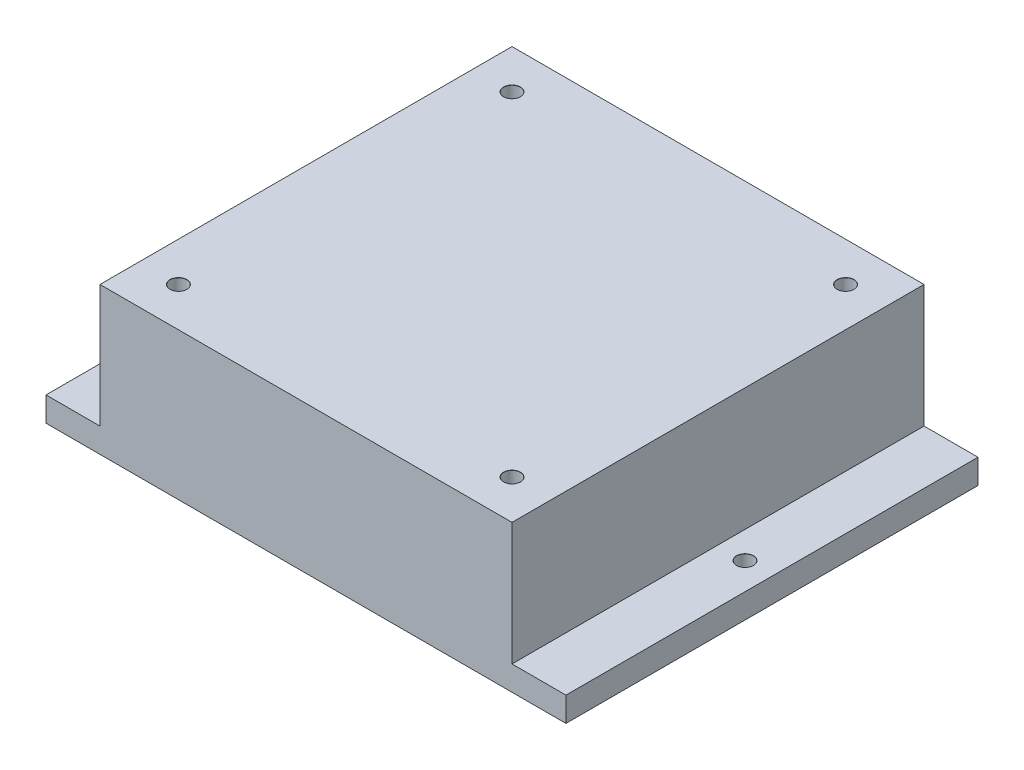
ISO-10303-21;
HEADER;
FILE_DESCRIPTION(('STEP AP214'),'2;1');
FILE_NAME('part.step','',(''),(''),'','','');
FILE_SCHEMA(('AUTOMOTIVE_DESIGN { 1 0 10303 214 1 1 1 1 }'));
ENDSEC;
DATA;
#1=APPLICATION_CONTEXT('core data for automotive mechanical design processes');
#2=APPLICATION_PROTOCOL_DEFINITION('international standard','automotive_design',2000,#1);
#3=PRODUCT_CONTEXT('',#1,'mechanical');
#4=PRODUCT('Part','Part','',(#3));
#5=PRODUCT_RELATED_PRODUCT_CATEGORY('part','',(#4));
#6=PRODUCT_DEFINITION_FORMATION('','',#4);
#7=PRODUCT_DEFINITION_CONTEXT('part definition',#1,'design');
#8=PRODUCT_DEFINITION('design','',#6,#7);
#9=PRODUCT_DEFINITION_SHAPE('','',#8);
#10=(LENGTH_UNIT() NAMED_UNIT(*) SI_UNIT(.MILLI.,.METRE.));
#11=(NAMED_UNIT(*) PLANE_ANGLE_UNIT() SI_UNIT($,.RADIAN.));
#12=(NAMED_UNIT(*) SI_UNIT($,.STERADIAN.) SOLID_ANGLE_UNIT());
#13=UNCERTAINTY_MEASURE_WITH_UNIT(LENGTH_MEASURE(1.E-05),#10,'distance_accuracy_value','');
#14=(GEOMETRIC_REPRESENTATION_CONTEXT(3) GLOBAL_UNCERTAINTY_ASSIGNED_CONTEXT((#13)) GLOBAL_UNIT_ASSIGNED_CONTEXT((#10,
#11,#12)) REPRESENTATION_CONTEXT('',''));
#15=CARTESIAN_POINT('',(0.,0.,0.));
#16=DIRECTION('',(0.,0.,1.));
#17=DIRECTION('',(1.,0.,0.));
#18=AXIS2_PLACEMENT_3D('',#15,#16,#17);
#19=CARTESIAN_POINT('',(53.,30.,-42.));
#20=DIRECTION('',(-1.,0.,0.));
#21=DIRECTION('',(0.,0.,1.));
#22=AXIS2_PLACEMENT_3D('',#19,#20,#21);
#23=PLANE('',#22);
#24=DIRECTION('',(0.,-1.,0.));
#25=VECTOR('',#24,1.);
#26=CARTESIAN_POINT('',(53.,30.,-42.));
#27=LINE('',#26,#25);
#28=CARTESIAN_POINT('',(53.,5.,-42.));
#29=VERTEX_POINT('',#28);
#30=CARTESIAN_POINT('',(53.,0.,-42.));
#31=VERTEX_POINT('',#30);
#32=EDGE_CURVE('E11',#29,#31,#27,.T.);
#33=ORIENTED_EDGE('',*,*,#32,.F.);
#34=DIRECTION('',(0.,0.,1.));
#35=VECTOR('',#34,1.);
#36=CARTESIAN_POINT('',(53.,5.,-42.));
#37=LINE('',#36,#35);
#38=CARTESIAN_POINT('',(53.,5.,42.));
#39=VERTEX_POINT('',#38);
#40=EDGE_CURVE('E176',#29,#39,#37,.T.);
#41=ORIENTED_EDGE('',*,*,#40,.T.);
#42=DIRECTION('',(0.,-1.,0.));
#43=VECTOR('',#42,1.);
#44=CARTESIAN_POINT('',(53.,30.,42.));
#45=LINE('',#44,#43);
#46=CARTESIAN_POINT('',(53.,0.,42.));
#47=VERTEX_POINT('',#46);
#48=EDGE_CURVE('E204',#39,#47,#45,.T.);
#49=ORIENTED_EDGE('',*,*,#48,.T.);
#50=DIRECTION('',(0.,0.,-1.));
#51=VECTOR('',#50,1.);
#52=CARTESIAN_POINT('',(53.,0.,-42.));
#53=LINE('',#52,#51);
#54=EDGE_CURVE('E179',#47,#31,#53,.T.);
#55=ORIENTED_EDGE('',*,*,#54,.T.);
#56=EDGE_LOOP('',(#33,#41,#49,#55));
#57=FACE_BOUND('',#56,.T.);
#58=ADVANCED_FACE('F47',(#57),#23,.F.);
#59=CARTESIAN_POINT('',(-53.,30.,-42.));
#60=DIRECTION('',(0.,0.,1.));
#61=DIRECTION('',(1.,0.,0.));
#62=AXIS2_PLACEMENT_3D('',#59,#60,#61);
#63=PLANE('',#62);
#64=DIRECTION('',(0.,-1.,0.));
#65=VECTOR('',#64,1.);
#66=CARTESIAN_POINT('',(42.,30.,-42.));
#67=LINE('',#66,#65);
#68=CARTESIAN_POINT('',(42.,30.,-42.));
#69=VERTEX_POINT('',#68);
#70=CARTESIAN_POINT('',(42.,4.99999999999999,-42.));
#71=VERTEX_POINT('',#70);
#72=EDGE_CURVE('E69',#69,#71,#67,.T.);
#73=ORIENTED_EDGE('',*,*,#72,.T.);
#74=DIRECTION('',(1.,0.,0.));
#75=VECTOR('',#74,1.);
#76=CARTESIAN_POINT('',(53.,5.,-42.));
#77=LINE('',#76,#75);
#78=EDGE_CURVE('E166',#71,#29,#77,.T.);
#79=ORIENTED_EDGE('',*,*,#78,.T.);
#80=ORIENTED_EDGE('',*,*,#32,.T.);
#81=DIRECTION('',(-1.,0.,0.));
#82=VECTOR('',#81,1.);
#83=CARTESIAN_POINT('',(-53.,0.,-42.));
#84=LINE('',#83,#82);
#85=CARTESIAN_POINT('',(-53.,0.,-42.));
#86=VERTEX_POINT('',#85);
#87=EDGE_CURVE('E207',#31,#86,#84,.T.);
#88=ORIENTED_EDGE('',*,*,#87,.T.);
#89=DIRECTION('',(0.,-1.,0.));
#90=VECTOR('',#89,1.);
#91=CARTESIAN_POINT('',(-53.,30.,-42.));
#92=LINE('',#91,#90);
#93=CARTESIAN_POINT('',(-53.,5.,-42.));
#94=VERTEX_POINT('',#93);
#95=EDGE_CURVE('E54',#94,#86,#92,.T.);
#96=ORIENTED_EDGE('',*,*,#95,.F.);
#97=DIRECTION('',(1.,0.,0.));
#98=VECTOR('',#97,1.);
#99=CARTESIAN_POINT('',(-53.,5.,-42.));
#100=LINE('',#99,#98);
#101=CARTESIAN_POINT('',(-42.,4.99999999999999,-42.));
#102=VERTEX_POINT('',#101);
#103=EDGE_CURVE('E183',#94,#102,#100,.T.);
#104=ORIENTED_EDGE('',*,*,#103,.T.);
#105=DIRECTION('',(0.,1.,0.));
#106=VECTOR('',#105,1.);
#107=CARTESIAN_POINT('',(-42.,30.,-42.));
#108=LINE('',#107,#106);
#109=CARTESIAN_POINT('',(-42.,30.,-42.));
#110=VERTEX_POINT('',#109);
#111=EDGE_CURVE('E186',#102,#110,#108,.T.);
#112=ORIENTED_EDGE('',*,*,#111,.T.);
#113=DIRECTION('',(-1.,0.,0.));
#114=VECTOR('',#113,1.);
#115=CARTESIAN_POINT('',(-53.,30.,-42.));
#116=LINE('',#115,#114);
#117=EDGE_CURVE('E197',#69,#110,#116,.T.);
#118=ORIENTED_EDGE('',*,*,#117,.F.);
#119=EDGE_LOOP('',(#73,#79,#80,#88,#96,#104,#112,#118));
#120=FACE_BOUND('',#119,.T.);
#121=ADVANCED_FACE('F226',(#120),#63,.F.);
#122=CARTESIAN_POINT('',(-53.,30.,-42.));
#123=DIRECTION('',(1.,0.,0.));
#124=DIRECTION('',(0.,0.,-1.));
#125=AXIS2_PLACEMENT_3D('',#122,#123,#124);
#126=PLANE('',#125);
#127=DIRECTION('',(0.,-1.,0.));
#128=VECTOR('',#127,1.);
#129=CARTESIAN_POINT('',(-53.,30.,42.));
#130=LINE('',#129,#128);
#131=CARTESIAN_POINT('',(-53.,5.,42.));
#132=VERTEX_POINT('',#131);
#133=CARTESIAN_POINT('',(-53.,0.,42.));
#134=VERTEX_POINT('',#133);
#135=EDGE_CURVE('E216',#132,#134,#130,.T.);
#136=ORIENTED_EDGE('',*,*,#135,.F.);
#137=DIRECTION('',(0.,0.,1.));
#138=VECTOR('',#137,1.);
#139=CARTESIAN_POINT('',(-53.,5.,-42.));
#140=LINE('',#139,#138);
#141=EDGE_CURVE('E189',#94,#132,#140,.T.);
#142=ORIENTED_EDGE('',*,*,#141,.F.);
#143=ORIENTED_EDGE('',*,*,#95,.T.);
#144=DIRECTION('',(0.,0.,1.));
#145=VECTOR('',#144,1.);
#146=CARTESIAN_POINT('',(-53.,0.,-42.));
#147=LINE('',#146,#145);
#148=EDGE_CURVE('E210',#86,#134,#147,.T.);
#149=ORIENTED_EDGE('',*,*,#148,.T.);
#150=EDGE_LOOP('',(#136,#142,#143,#149));
#151=FACE_BOUND('',#150,.T.);
#152=ADVANCED_FACE('F221',(#151),#126,.F.);
#153=CARTESIAN_POINT('',(-53.,30.,42.));
#154=DIRECTION('',(0.,0.,-1.));
#155=DIRECTION('',(-1.,0.,0.));
#156=AXIS2_PLACEMENT_3D('',#153,#154,#155);
#157=PLANE('',#156);
#158=ORIENTED_EDGE('',*,*,#48,.F.);
#159=DIRECTION('',(1.,0.,0.));
#160=VECTOR('',#159,1.);
#161=CARTESIAN_POINT('',(53.,5.,42.));
#162=LINE('',#161,#160);
#163=CARTESIAN_POINT('',(42.,4.99999999999999,42.));
#164=VERTEX_POINT('',#163);
#165=EDGE_CURVE('E167',#164,#39,#162,.T.);
#166=ORIENTED_EDGE('',*,*,#165,.F.);
#167=DIRECTION('',(0.,-1.,0.));
#168=VECTOR('',#167,1.);
#169=CARTESIAN_POINT('',(42.,30.,42.));
#170=LINE('',#169,#168);
#171=CARTESIAN_POINT('',(42.,30.,42.));
#172=VERTEX_POINT('',#171);
#173=EDGE_CURVE('E171',#172,#164,#170,.T.);
#174=ORIENTED_EDGE('',*,*,#173,.F.);
#175=DIRECTION('',(1.,0.,0.));
#176=VECTOR('',#175,1.);
#177=CARTESIAN_POINT('',(-53.,30.,42.));
#178=LINE('',#177,#176);
#179=CARTESIAN_POINT('',(-42.,30.,42.));
#180=VERTEX_POINT('',#179);
#181=EDGE_CURVE('E200',#180,#172,#178,.T.);
#182=ORIENTED_EDGE('',*,*,#181,.F.);
#183=DIRECTION('',(0.,1.,0.));
#184=VECTOR('',#183,1.);
#185=CARTESIAN_POINT('',(-42.,30.,42.));
#186=LINE('',#185,#184);
#187=CARTESIAN_POINT('',(-42.,4.99999999999999,42.));
#188=VERTEX_POINT('',#187);
#189=EDGE_CURVE('E61',#188,#180,#186,.T.);
#190=ORIENTED_EDGE('',*,*,#189,.F.);
#191=DIRECTION('',(1.,0.,0.));
#192=VECTOR('',#191,1.);
#193=CARTESIAN_POINT('',(-53.,5.,42.));
#194=LINE('',#193,#192);
#195=EDGE_CURVE('E164',#132,#188,#194,.T.);
#196=ORIENTED_EDGE('',*,*,#195,.F.);
#197=ORIENTED_EDGE('',*,*,#135,.T.);
#198=DIRECTION('',(1.,0.,0.));
#199=VECTOR('',#198,1.);
#200=CARTESIAN_POINT('',(-53.,0.,42.));
#201=LINE('',#200,#199);
#202=EDGE_CURVE('E201',#134,#47,#201,.T.);
#203=ORIENTED_EDGE('',*,*,#202,.T.);
#204=EDGE_LOOP('',(#158,#166,#174,#182,#190,#196,#197,#203));
#205=FACE_BOUND('',#204,.T.);
#206=ADVANCED_FACE('F233',(#205),#157,.F.);
#207=CARTESIAN_POINT('',(0.,30.,0.));
#208=DIRECTION('',(0.,1.,0.));
#209=DIRECTION('',(0.,0.,1.));
#210=AXIS2_PLACEMENT_3D('',#207,#208,#209);
#211=PLANE('',#210);
#212=CARTESIAN_POINT('',(-34.,30.,-34.));
#213=DIRECTION('',(0.,1.,0.));
#214=DIRECTION('',(0.,0.,1.));
#215=AXIS2_PLACEMENT_3D('',#212,#213,#214);
#216=CIRCLE('',#215,1.725);
#217=CARTESIAN_POINT('',(-34.,30.,-32.275));
#218=VERTEX_POINT('',#217);
#219=EDGE_CURVE('E137',#218,#218,#216,.T.);
#220=ORIENTED_EDGE('',*,*,#219,.F.);
#221=EDGE_LOOP('',(#220));
#222=FACE_BOUND('',#221,.T.);
#223=CARTESIAN_POINT('',(34.,30.,-34.));
#224=DIRECTION('',(0.,1.,0.));
#225=DIRECTION('',(0.,0.,1.));
#226=AXIS2_PLACEMENT_3D('',#223,#224,#225);
#227=CIRCLE('',#226,1.725);
#228=CARTESIAN_POINT('',(34.,30.,-32.275));
#229=VERTEX_POINT('',#228);
#230=EDGE_CURVE('E130',#229,#229,#227,.T.);
#231=ORIENTED_EDGE('',*,*,#230,.F.);
#232=EDGE_LOOP('',(#231));
#233=FACE_BOUND('',#232,.T.);
#234=CARTESIAN_POINT('',(34.,30.,34.));
#235=DIRECTION('',(0.,1.,0.));
#236=DIRECTION('',(0.,0.,1.));
#237=AXIS2_PLACEMENT_3D('',#234,#235,#236);
#238=CIRCLE('',#237,1.725);
#239=CARTESIAN_POINT('',(34.,30.,35.725));
#240=VERTEX_POINT('',#239);
#241=EDGE_CURVE('E146',#240,#240,#238,.T.);
#242=ORIENTED_EDGE('',*,*,#241,.F.);
#243=EDGE_LOOP('',(#242));
#244=FACE_BOUND('',#243,.T.);
#245=CARTESIAN_POINT('',(-34.,30.,34.));
#246=DIRECTION('',(0.,1.,0.));
#247=DIRECTION('',(0.,0.,1.));
#248=AXIS2_PLACEMENT_3D('',#245,#246,#247);
#249=CIRCLE('',#248,1.725);
#250=CARTESIAN_POINT('',(-34.,30.,35.725));
#251=VERTEX_POINT('',#250);
#252=EDGE_CURVE('E155',#251,#251,#249,.T.);
#253=ORIENTED_EDGE('',*,*,#252,.F.);
#254=EDGE_LOOP('',(#253));
#255=FACE_BOUND('',#254,.T.);
#256=DIRECTION('',(0.,0.,1.));
#257=VECTOR('',#256,1.);
#258=CARTESIAN_POINT('',(42.,30.,-42.));
#259=LINE('',#258,#257);
#260=EDGE_CURVE('E170',#69,#172,#259,.T.);
#261=ORIENTED_EDGE('',*,*,#260,.F.);
#262=ORIENTED_EDGE('',*,*,#117,.T.);
#263=DIRECTION('',(0.,0.,1.));
#264=VECTOR('',#263,1.);
#265=CARTESIAN_POINT('',(-42.,30.,-42.));
#266=LINE('',#265,#264);
#267=EDGE_CURVE('E174',#110,#180,#266,.T.);
#268=ORIENTED_EDGE('',*,*,#267,.T.);
#269=ORIENTED_EDGE('',*,*,#181,.T.);
#270=EDGE_LOOP('',(#261,#262,#268,#269));
#271=FACE_BOUND('',#270,.T.);
#272=ADVANCED_FACE('F242',(#222,#233,#244,#255,#271),#211,.T.);
#273=CARTESIAN_POINT('',(0.,0.,0.));
#274=DIRECTION('',(0.,1.,0.));
#275=DIRECTION('',(0.,0.,1.));
#276=AXIS2_PLACEMENT_3D('',#273,#274,#275);
#277=PLANE('',#276);
#278=CARTESIAN_POINT('',(-47.5,0.,0.));
#279=DIRECTION('',(0.,1.,0.));
#280=DIRECTION('',(0.,0.,1.));
#281=AXIS2_PLACEMENT_3D('',#278,#279,#280);
#282=CIRCLE('',#281,1.7);
#283=CARTESIAN_POINT('',(-47.5,0.,1.7));
#284=VERTEX_POINT('',#283);
#285=EDGE_CURVE('E343',#284,#284,#282,.T.);
#286=ORIENTED_EDGE('',*,*,#285,.T.);
#287=EDGE_LOOP('',(#286));
#288=FACE_BOUND('',#287,.T.);
#289=CARTESIAN_POINT('',(47.5,0.,0.));
#290=DIRECTION('',(0.,1.,0.));
#291=DIRECTION('',(0.,0.,1.));
#292=AXIS2_PLACEMENT_3D('',#289,#290,#291);
#293=CIRCLE('',#292,1.7);
#294=CARTESIAN_POINT('',(47.5,0.,1.7));
#295=VERTEX_POINT('',#294);
#296=EDGE_CURVE('E354',#295,#295,#293,.T.);
#297=ORIENTED_EDGE('',*,*,#296,.T.);
#298=EDGE_LOOP('',(#297));
#299=FACE_BOUND('',#298,.T.);
#300=ORIENTED_EDGE('',*,*,#54,.F.);
#301=ORIENTED_EDGE('',*,*,#202,.F.);
#302=ORIENTED_EDGE('',*,*,#148,.F.);
#303=ORIENTED_EDGE('',*,*,#87,.F.);
#304=EDGE_LOOP('',(#300,#301,#302,#303));
#305=FACE_BOUND('',#304,.T.);
#306=ADVANCED_FACE('F230',(#288,#299,#305),#277,.F.);
#307=CARTESIAN_POINT('',(-42.,30.,-42.));
#308=DIRECTION('',(1.,0.,0.));
#309=DIRECTION('',(0.,0.,-1.));
#310=AXIS2_PLACEMENT_3D('',#307,#308,#309);
#311=PLANE('',#310);
#312=ORIENTED_EDGE('',*,*,#189,.T.);
#313=ORIENTED_EDGE('',*,*,#267,.F.);
#314=ORIENTED_EDGE('',*,*,#111,.F.);
#315=DIRECTION('',(0.,0.,1.));
#316=VECTOR('',#315,1.);
#317=CARTESIAN_POINT('',(-42.,4.99999999999999,-42.));
#318=LINE('',#317,#316);
#319=EDGE_CURVE('E194',#102,#188,#318,.T.);
#320=ORIENTED_EDGE('',*,*,#319,.T.);
#321=EDGE_LOOP('',(#312,#313,#314,#320));
#322=FACE_BOUND('',#321,.T.);
#323=ADVANCED_FACE('F262',(#322),#311,.F.);
#324=CARTESIAN_POINT('',(-53.,5.,-42.));
#325=DIRECTION('',(0.,-1.,0.));
#326=DIRECTION('',(1.,0.,0.));
#327=AXIS2_PLACEMENT_3D('',#324,#325,#326);
#328=PLANE('',#327);
#329=CARTESIAN_POINT('',(-47.5,5.,0.));
#330=DIRECTION('',(0.,1.,0.));
#331=DIRECTION('',(0.,0.,1.));
#332=AXIS2_PLACEMENT_3D('',#329,#330,#331);
#333=CIRCLE('',#332,1.725);
#334=CARTESIAN_POINT('',(-47.5,5.,1.725));
#335=VERTEX_POINT('',#334);
#336=EDGE_CURVE('E341',#335,#335,#333,.T.);
#337=ORIENTED_EDGE('',*,*,#336,.F.);
#338=EDGE_LOOP('',(#337));
#339=FACE_BOUND('',#338,.T.);
#340=ORIENTED_EDGE('',*,*,#195,.T.);
#341=ORIENTED_EDGE('',*,*,#319,.F.);
#342=ORIENTED_EDGE('',*,*,#103,.F.);
#343=ORIENTED_EDGE('',*,*,#141,.T.);
#344=EDGE_LOOP('',(#340,#341,#342,#343));
#345=FACE_BOUND('',#344,.T.);
#346=ADVANCED_FACE('F238',(#339,#345),#328,.F.);
#347=CARTESIAN_POINT('',(53.,5.,-42.));
#348=DIRECTION('',(0.,-1.,0.));
#349=DIRECTION('',(1.,0.,0.));
#350=AXIS2_PLACEMENT_3D('',#347,#348,#349);
#351=PLANE('',#350);
#352=CARTESIAN_POINT('',(47.5,4.99999999999998,0.));
#353=DIRECTION('',(0.,1.,0.));
#354=DIRECTION('',(0.,0.,1.));
#355=AXIS2_PLACEMENT_3D('',#352,#353,#354);
#356=CIRCLE('',#355,1.725);
#357=CARTESIAN_POINT('',(47.5,4.99999999999998,1.725));
#358=VERTEX_POINT('',#357);
#359=EDGE_CURVE('E348',#358,#358,#356,.T.);
#360=ORIENTED_EDGE('',*,*,#359,.F.);
#361=EDGE_LOOP('',(#360));
#362=FACE_BOUND('',#361,.T.);
#363=ORIENTED_EDGE('',*,*,#165,.T.);
#364=ORIENTED_EDGE('',*,*,#40,.F.);
#365=ORIENTED_EDGE('',*,*,#78,.F.);
#366=DIRECTION('',(0.,0.,1.));
#367=VECTOR('',#366,1.);
#368=CARTESIAN_POINT('',(42.,4.99999999999999,-42.));
#369=LINE('',#368,#367);
#370=EDGE_CURVE('E180',#71,#164,#369,.T.);
#371=ORIENTED_EDGE('',*,*,#370,.T.);
#372=EDGE_LOOP('',(#363,#364,#365,#371));
#373=FACE_BOUND('',#372,.T.);
#374=ADVANCED_FACE('F246',(#362,#373),#351,.F.);
#375=CARTESIAN_POINT('',(42.,30.,-42.));
#376=DIRECTION('',(-1.,0.,0.));
#377=DIRECTION('',(0.,0.,1.));
#378=AXIS2_PLACEMENT_3D('',#375,#376,#377);
#379=PLANE('',#378);
#380=ORIENTED_EDGE('',*,*,#173,.T.);
#381=ORIENTED_EDGE('',*,*,#370,.F.);
#382=ORIENTED_EDGE('',*,*,#72,.F.);
#383=ORIENTED_EDGE('',*,*,#260,.T.);
#384=EDGE_LOOP('',(#380,#381,#382,#383));
#385=FACE_BOUND('',#384,.T.);
#386=ADVANCED_FACE('F244',(#385),#379,.F.);
#387=CARTESIAN_POINT('',(-34.,20.,34.));
#388=DIRECTION('',(0.,1.,0.));
#389=DIRECTION('',(0.,0.,1.));
#390=AXIS2_PLACEMENT_3D('',#387,#388,#389);
#391=CONICAL_SURFACE('',#390,1.69999999999999,1.02974425867665);
#392=CARTESIAN_POINT('',(-34.,18.9785369476531,34.));
#393=VERTEX_POINT('',#392);
#394=VERTEX_LOOP('',#393);
#395=FACE_BOUND('',#394,.T.);
#396=CARTESIAN_POINT('',(-34.,20.,34.));
#397=DIRECTION('',(0.,1.,0.));
#398=DIRECTION('',(0.,0.,1.));
#399=AXIS2_PLACEMENT_3D('',#396,#397,#398);
#400=CIRCLE('',#399,1.69999999999999);
#401=CARTESIAN_POINT('',(-34.,20.,35.7));
#402=VERTEX_POINT('',#401);
#403=EDGE_CURVE('E161',#402,#402,#400,.T.);
#404=ORIENTED_EDGE('',*,*,#403,.T.);
#405=EDGE_LOOP('',(#404));
#406=FACE_BOUND('',#405,.T.);
#407=ADVANCED_FACE('F274',(#395,#406),#391,.F.);
#408=CARTESIAN_POINT('',(-34.,30.,34.));
#409=DIRECTION('',(0.,1.,0.));
#410=DIRECTION('',(0.,0.,1.));
#411=AXIS2_PLACEMENT_3D('',#408,#409,#410);
#412=CYLINDRICAL_SURFACE('',#411,1.69999999999999);
#413=ORIENTED_EDGE('',*,*,#403,.F.);
#414=EDGE_LOOP('',(#413));
#415=FACE_BOUND('',#414,.T.);
#416=CARTESIAN_POINT('',(-34.,29.975,34.));
#417=DIRECTION('',(0.,1.,0.));
#418=DIRECTION('',(0.,0.,1.));
#419=AXIS2_PLACEMENT_3D('',#416,#417,#418);
#420=CIRCLE('',#419,1.69999999999999);
#421=CARTESIAN_POINT('',(-34.,29.975,35.7));
#422=VERTEX_POINT('',#421);
#423=EDGE_CURVE('E158',#422,#422,#420,.T.);
#424=ORIENTED_EDGE('',*,*,#423,.T.);
#425=EDGE_LOOP('',(#424));
#426=FACE_BOUND('',#425,.T.);
#427=ADVANCED_FACE('F280',(#415,#426),#412,.F.);
#428=CARTESIAN_POINT('',(-34.,30.,34.));
#429=DIRECTION('',(0.,1.,0.));
#430=DIRECTION('',(0.,0.,1.));
#431=AXIS2_PLACEMENT_3D('',#428,#429,#430);
#432=CONICAL_SURFACE('',#431,1.725,0.78539816339731);
#433=ORIENTED_EDGE('',*,*,#423,.F.);
#434=EDGE_LOOP('',(#433));
#435=FACE_BOUND('',#434,.T.);
#436=ORIENTED_EDGE('',*,*,#252,.T.);
#437=EDGE_LOOP('',(#436));
#438=FACE_BOUND('',#437,.T.);
#439=ADVANCED_FACE('F284',(#435,#438),#432,.F.);
#440=CARTESIAN_POINT('',(34.,20.,34.));
#441=DIRECTION('',(0.,1.,0.));
#442=DIRECTION('',(0.,0.,1.));
#443=AXIS2_PLACEMENT_3D('',#440,#441,#442);
#444=CONICAL_SURFACE('',#443,1.69999999999999,1.02974425867665);
#445=CARTESIAN_POINT('',(34.,18.9785369476531,34.));
#446=VERTEX_POINT('',#445);
#447=VERTEX_LOOP('',#446);
#448=FACE_BOUND('',#447,.T.);
#449=CARTESIAN_POINT('',(34.,20.,34.));
#450=DIRECTION('',(0.,1.,0.));
#451=DIRECTION('',(0.,0.,1.));
#452=AXIS2_PLACEMENT_3D('',#449,#450,#451);
#453=CIRCLE('',#452,1.69999999999999);
#454=CARTESIAN_POINT('',(34.,20.,35.7));
#455=VERTEX_POINT('',#454);
#456=EDGE_CURVE('E152',#455,#455,#453,.T.);
#457=ORIENTED_EDGE('',*,*,#456,.T.);
#458=EDGE_LOOP('',(#457));
#459=FACE_BOUND('',#458,.T.);
#460=ADVANCED_FACE('F288',(#448,#459),#444,.F.);
#461=CARTESIAN_POINT('',(34.,30.,34.));
#462=DIRECTION('',(0.,1.,0.));
#463=DIRECTION('',(0.,0.,1.));
#464=AXIS2_PLACEMENT_3D('',#461,#462,#463);
#465=CYLINDRICAL_SURFACE('',#464,1.69999999999999);
#466=ORIENTED_EDGE('',*,*,#456,.F.);
#467=EDGE_LOOP('',(#466));
#468=FACE_BOUND('',#467,.T.);
#469=CARTESIAN_POINT('',(34.,29.975,34.));
#470=DIRECTION('',(0.,1.,0.));
#471=DIRECTION('',(0.,0.,1.));
#472=AXIS2_PLACEMENT_3D('',#469,#470,#471);
#473=CIRCLE('',#472,1.69999999999999);
#474=CARTESIAN_POINT('',(34.,29.975,35.7));
#475=VERTEX_POINT('',#474);
#476=EDGE_CURVE('E149',#475,#475,#473,.T.);
#477=ORIENTED_EDGE('',*,*,#476,.T.);
#478=EDGE_LOOP('',(#477));
#479=FACE_BOUND('',#478,.T.);
#480=ADVANCED_FACE('F292',(#468,#479),#465,.F.);
#481=CARTESIAN_POINT('',(34.,30.,34.));
#482=DIRECTION('',(0.,1.,0.));
#483=DIRECTION('',(0.,0.,1.));
#484=AXIS2_PLACEMENT_3D('',#481,#482,#483);
#485=CONICAL_SURFACE('',#484,1.725,0.785398163397448);
#486=ORIENTED_EDGE('',*,*,#476,.F.);
#487=EDGE_LOOP('',(#486));
#488=FACE_BOUND('',#487,.T.);
#489=ORIENTED_EDGE('',*,*,#241,.T.);
#490=EDGE_LOOP('',(#489));
#491=FACE_BOUND('',#490,.T.);
#492=ADVANCED_FACE('F296',(#488,#491),#485,.F.);
#493=CARTESIAN_POINT('',(34.,20.,-34.));
#494=DIRECTION('',(0.,1.,0.));
#495=DIRECTION('',(0.,0.,1.));
#496=AXIS2_PLACEMENT_3D('',#493,#494,#495);
#497=CONICAL_SURFACE('',#496,1.69999999999999,1.02974425867665);
#498=CARTESIAN_POINT('',(34.,18.9785369476531,-34.));
#499=VERTEX_POINT('',#498);
#500=VERTEX_LOOP('',#499);
#501=FACE_BOUND('',#500,.T.);
#502=CARTESIAN_POINT('',(34.,20.,-34.));
#503=DIRECTION('',(0.,1.,0.));
#504=DIRECTION('',(0.,0.,1.));
#505=AXIS2_PLACEMENT_3D('',#502,#503,#504);
#506=CIRCLE('',#505,1.69999999999999);
#507=CARTESIAN_POINT('',(34.,20.,-32.3));
#508=VERTEX_POINT('',#507);
#509=EDGE_CURVE('E143',#508,#508,#506,.T.);
#510=ORIENTED_EDGE('',*,*,#509,.T.);
#511=EDGE_LOOP('',(#510));
#512=FACE_BOUND('',#511,.T.);
#513=ADVANCED_FACE('F300',(#501,#512),#497,.F.);
#514=CARTESIAN_POINT('',(34.,30.,-34.));
#515=DIRECTION('',(0.,1.,0.));
#516=DIRECTION('',(0.,0.,1.));
#517=AXIS2_PLACEMENT_3D('',#514,#515,#516);
#518=CYLINDRICAL_SURFACE('',#517,1.69999999999999);
#519=ORIENTED_EDGE('',*,*,#509,.F.);
#520=EDGE_LOOP('',(#519));
#521=FACE_BOUND('',#520,.T.);
#522=CARTESIAN_POINT('',(34.,29.975,-34.));
#523=DIRECTION('',(0.,1.,0.));
#524=DIRECTION('',(0.,0.,1.));
#525=AXIS2_PLACEMENT_3D('',#522,#523,#524);
#526=CIRCLE('',#525,1.69999999999999);
#527=CARTESIAN_POINT('',(34.,29.975,-32.3));
#528=VERTEX_POINT('',#527);
#529=EDGE_CURVE('E134',#528,#528,#526,.T.);
#530=ORIENTED_EDGE('',*,*,#529,.T.);
#531=EDGE_LOOP('',(#530));
#532=FACE_BOUND('',#531,.T.);
#533=ADVANCED_FACE('F304',(#521,#532),#518,.F.);
#534=CARTESIAN_POINT('',(34.,30.,-34.));
#535=DIRECTION('',(0.,1.,0.));
#536=DIRECTION('',(0.,0.,1.));
#537=AXIS2_PLACEMENT_3D('',#534,#535,#536);
#538=CONICAL_SURFACE('',#537,1.725,0.785398163397448);
#539=ORIENTED_EDGE('',*,*,#529,.F.);
#540=EDGE_LOOP('',(#539));
#541=FACE_BOUND('',#540,.T.);
#542=ORIENTED_EDGE('',*,*,#230,.T.);
#543=EDGE_LOOP('',(#542));
#544=FACE_BOUND('',#543,.T.);
#545=ADVANCED_FACE('F124',(#541,#544),#538,.F.);
#546=CARTESIAN_POINT('',(-34.,20.,-34.));
#547=DIRECTION('',(0.,1.,0.));
#548=DIRECTION('',(0.,0.,1.));
#549=AXIS2_PLACEMENT_3D('',#546,#547,#548);
#550=CONICAL_SURFACE('',#549,1.69999999999999,1.02974425867665);
#551=CARTESIAN_POINT('',(-34.,18.9785369476531,-34.));
#552=VERTEX_POINT('',#551);
#553=VERTEX_LOOP('',#552);
#554=FACE_BOUND('',#553,.T.);
#555=CARTESIAN_POINT('',(-34.,20.,-34.));
#556=DIRECTION('',(0.,1.,0.));
#557=DIRECTION('',(0.,0.,1.));
#558=AXIS2_PLACEMENT_3D('',#555,#556,#557);
#559=CIRCLE('',#558,1.69999999999999);
#560=CARTESIAN_POINT('',(-34.,20.,-32.3));
#561=VERTEX_POINT('',#560);
#562=EDGE_CURVE('E128',#561,#561,#559,.T.);
#563=ORIENTED_EDGE('',*,*,#562,.T.);
#564=EDGE_LOOP('',(#563));
#565=FACE_BOUND('',#564,.T.);
#566=ADVANCED_FACE('F120',(#554,#565),#550,.F.);
#567=CARTESIAN_POINT('',(-34.,30.,-34.));
#568=DIRECTION('',(0.,1.,0.));
#569=DIRECTION('',(0.,0.,1.));
#570=AXIS2_PLACEMENT_3D('',#567,#568,#569);
#571=CYLINDRICAL_SURFACE('',#570,1.69999999999999);
#572=ORIENTED_EDGE('',*,*,#562,.F.);
#573=EDGE_LOOP('',(#572));
#574=FACE_BOUND('',#573,.T.);
#575=CARTESIAN_POINT('',(-34.,29.975,-34.));
#576=DIRECTION('',(0.,1.,0.));
#577=DIRECTION('',(0.,0.,1.));
#578=AXIS2_PLACEMENT_3D('',#575,#576,#577);
#579=CIRCLE('',#578,1.69999999999999);
#580=CARTESIAN_POINT('',(-34.,29.975,-32.3));
#581=VERTEX_POINT('',#580);
#582=EDGE_CURVE('E131',#581,#581,#579,.T.);
#583=ORIENTED_EDGE('',*,*,#582,.T.);
#584=EDGE_LOOP('',(#583));
#585=FACE_BOUND('',#584,.T.);
#586=ADVANCED_FACE('F123',(#574,#585),#571,.F.);
#587=CARTESIAN_POINT('',(-34.,30.,-34.));
#588=DIRECTION('',(0.,1.,0.));
#589=DIRECTION('',(0.,0.,1.));
#590=AXIS2_PLACEMENT_3D('',#587,#588,#589);
#591=CONICAL_SURFACE('',#590,1.725,0.78539816339731);
#592=ORIENTED_EDGE('',*,*,#582,.F.);
#593=EDGE_LOOP('',(#592));
#594=FACE_BOUND('',#593,.T.);
#595=ORIENTED_EDGE('',*,*,#219,.T.);
#596=EDGE_LOOP('',(#595));
#597=FACE_BOUND('',#596,.T.);
#598=ADVANCED_FACE('F314',(#594,#597),#591,.F.);
#599=CARTESIAN_POINT('',(47.5,4.99999999999998,0.));
#600=DIRECTION('',(0.,1.,0.));
#601=DIRECTION('',(0.,0.,1.));
#602=AXIS2_PLACEMENT_3D('',#599,#600,#601);
#603=CYLINDRICAL_SURFACE('',#602,1.69999999999999);
#604=ORIENTED_EDGE('',*,*,#296,.F.);
#605=EDGE_LOOP('',(#604));
#606=FACE_BOUND('',#605,.T.);
#607=CARTESIAN_POINT('',(47.5,4.97499999999995,0.));
#608=DIRECTION('',(0.,1.,0.));
#609=DIRECTION('',(0.,0.,1.));
#610=AXIS2_PLACEMENT_3D('',#607,#608,#609);
#611=CIRCLE('',#610,1.69999999999999);
#612=CARTESIAN_POINT('',(47.5,4.97499999999995,1.69999999999999));
#613=VERTEX_POINT('',#612);
#614=EDGE_CURVE('E351',#613,#613,#611,.T.);
#615=ORIENTED_EDGE('',*,*,#614,.T.);
#616=EDGE_LOOP('',(#615));
#617=FACE_BOUND('',#616,.T.);
#618=ADVANCED_FACE('F317',(#606,#617),#603,.F.);
#619=CARTESIAN_POINT('',(47.5,4.99999999999998,0.));
#620=DIRECTION('',(0.,1.,0.));
#621=DIRECTION('',(0.,0.,1.));
#622=AXIS2_PLACEMENT_3D('',#619,#620,#621);
#623=CONICAL_SURFACE('',#622,1.725,0.785398163397136);
#624=ORIENTED_EDGE('',*,*,#614,.F.);
#625=EDGE_LOOP('',(#624));
#626=FACE_BOUND('',#625,.T.);
#627=ORIENTED_EDGE('',*,*,#359,.T.);
#628=EDGE_LOOP('',(#627));
#629=FACE_BOUND('',#628,.T.);
#630=ADVANCED_FACE('F321',(#626,#629),#623,.F.);
#631=CARTESIAN_POINT('',(-47.5,4.99999999999999,0.));
#632=DIRECTION('',(0.,1.,0.));
#633=DIRECTION('',(0.,0.,1.));
#634=AXIS2_PLACEMENT_3D('',#631,#632,#633);
#635=CYLINDRICAL_SURFACE('',#634,1.69999999999999);
#636=ORIENTED_EDGE('',*,*,#285,.F.);
#637=EDGE_LOOP('',(#636));
#638=FACE_BOUND('',#637,.T.);
#639=CARTESIAN_POINT('',(-47.5,4.97499999999997,0.));
#640=DIRECTION('',(0.,1.,0.));
#641=DIRECTION('',(0.,0.,1.));
#642=AXIS2_PLACEMENT_3D('',#639,#640,#641);
#643=CIRCLE('',#642,1.69999999999999);
#644=CARTESIAN_POINT('',(-47.5,4.97499999999997,1.69999999999999));
#645=VERTEX_POINT('',#644);
#646=EDGE_CURVE('E338',#645,#645,#643,.T.);
#647=ORIENTED_EDGE('',*,*,#646,.T.);
#648=EDGE_LOOP('',(#647));
#649=FACE_BOUND('',#648,.T.);
#650=ADVANCED_FACE('F325',(#638,#649),#635,.F.);
#651=CARTESIAN_POINT('',(-47.5,5.,0.));
#652=DIRECTION('',(0.,1.,0.));
#653=DIRECTION('',(0.,0.,1.));
#654=AXIS2_PLACEMENT_3D('',#651,#652,#653);
#655=CONICAL_SURFACE('',#654,1.725,0.785398163397275);
#656=ORIENTED_EDGE('',*,*,#646,.F.);
#657=EDGE_LOOP('',(#656));
#658=FACE_BOUND('',#657,.T.);
#659=ORIENTED_EDGE('',*,*,#336,.T.);
#660=EDGE_LOOP('',(#659));
#661=FACE_BOUND('',#660,.T.);
#662=ADVANCED_FACE('F329',(#658,#661),#655,.F.);
#663=CLOSED_SHELL('',(#58,#121,#152,#206,#272,#306,#323,#346,#374,#386,#407,#427,#439,#460,#480,
#492,#513,#533,#545,#566,#586,#598,#618,#630,#650,#662));
#664=MANIFOLD_SOLID_BREP('B2',#663);
#665=ADVANCED_BREP_SHAPE_REPRESENTATION('',(#18,#664),#14);
#666=SHAPE_DEFINITION_REPRESENTATION(#9,#665);
ENDSEC;
END-ISO-10303-21;
